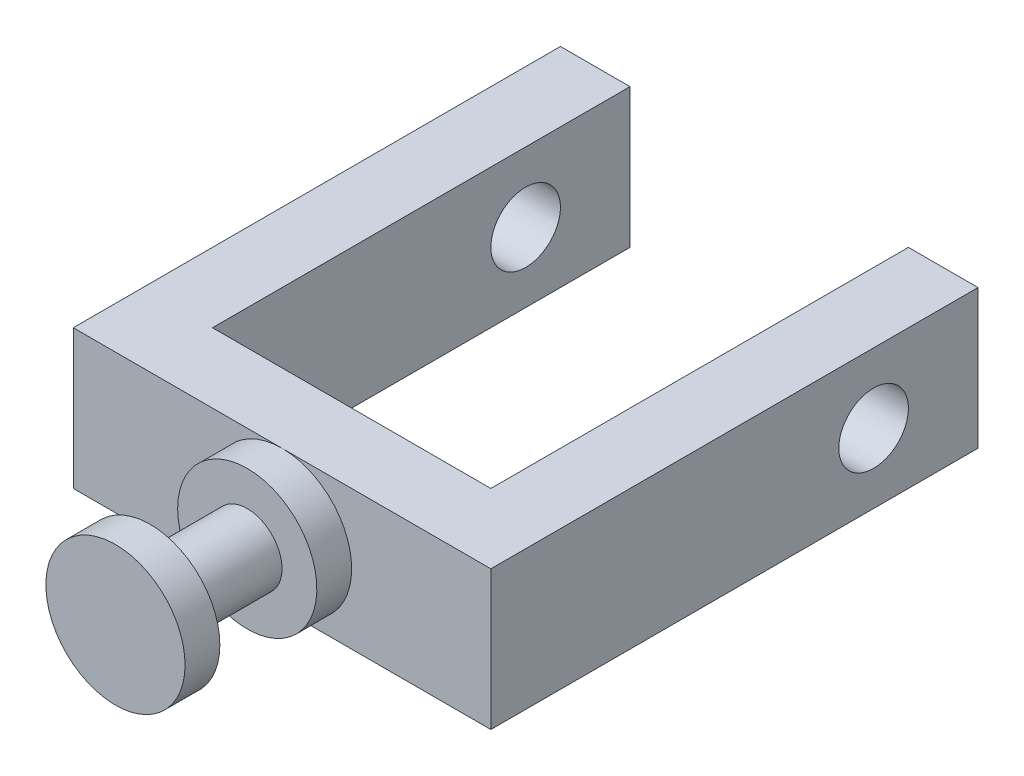
ISO-10303-21;
HEADER;
FILE_DESCRIPTION(('STEP AP214'),'2;1');
FILE_NAME('part.step','',(''),(''),'','','');
FILE_SCHEMA(('AUTOMOTIVE_DESIGN { 1 0 10303 214 1 1 1 1 }'));
ENDSEC;
DATA;
#1=APPLICATION_CONTEXT('core data for automotive mechanical design processes');
#2=APPLICATION_PROTOCOL_DEFINITION('international standard','automotive_design',2000,#1);
#3=PRODUCT_CONTEXT('',#1,'mechanical');
#4=PRODUCT('Part','Part','',(#3));
#5=PRODUCT_RELATED_PRODUCT_CATEGORY('part','',(#4));
#6=PRODUCT_DEFINITION_FORMATION('','',#4);
#7=PRODUCT_DEFINITION_CONTEXT('part definition',#1,'design');
#8=PRODUCT_DEFINITION('design','',#6,#7);
#9=PRODUCT_DEFINITION_SHAPE('','',#8);
#10=(LENGTH_UNIT() NAMED_UNIT(*) SI_UNIT(.MILLI.,.METRE.));
#11=(NAMED_UNIT(*) PLANE_ANGLE_UNIT() SI_UNIT($,.RADIAN.));
#12=(NAMED_UNIT(*) SI_UNIT($,.STERADIAN.) SOLID_ANGLE_UNIT());
#13=UNCERTAINTY_MEASURE_WITH_UNIT(LENGTH_MEASURE(1.E-05),#10,'distance_accuracy_value','');
#14=(GEOMETRIC_REPRESENTATION_CONTEXT(3) GLOBAL_UNCERTAINTY_ASSIGNED_CONTEXT((#13)) GLOBAL_UNIT_ASSIGNED_CONTEXT((#10,
#11,#12)) REPRESENTATION_CONTEXT('',''));
#15=CARTESIAN_POINT('',(0.,0.,0.));
#16=DIRECTION('',(0.,0.,1.));
#17=DIRECTION('',(1.,0.,0.));
#18=AXIS2_PLACEMENT_3D('',#15,#16,#17);
#19=CARTESIAN_POINT('',(0.,0.,-86.2));
#20=DIRECTION('',(0.,0.,-1.));
#21=DIRECTION('',(-1.,0.,0.));
#22=AXIS2_PLACEMENT_3D('',#19,#20,#21);
#23=PLANE('',#22);
#24=DIRECTION('',(-1.,0.,0.));
#25=VECTOR('',#24,1.);
#26=CARTESIAN_POINT('',(76.2,-25.4,-86.2));
#27=LINE('',#26,#25);
#28=CARTESIAN_POINT('',(50.8,-25.4,-86.2));
#29=VERTEX_POINT('',#28);
#30=CARTESIAN_POINT('',(-50.8,-25.4,-86.2));
#31=VERTEX_POINT('',#30);
#32=EDGE_CURVE('E157',#29,#31,#27,.T.);
#33=ORIENTED_EDGE('',*,*,#32,.T.);
#34=DIRECTION('',(0.,-1.,0.));
#35=VECTOR('',#34,1.);
#36=CARTESIAN_POINT('',(-50.8,-25.4,-86.2));
#37=LINE('',#36,#35);
#38=CARTESIAN_POINT('',(-50.8,25.4,-86.2));
#39=VERTEX_POINT('',#38);
#40=EDGE_CURVE('E130',#39,#31,#37,.T.);
#41=ORIENTED_EDGE('',*,*,#40,.F.);
#42=DIRECTION('',(-1.,0.,0.));
#43=VECTOR('',#42,1.);
#44=CARTESIAN_POINT('',(76.2,25.4,-86.2));
#45=LINE('',#44,#43);
#46=CARTESIAN_POINT('',(50.8,25.4,-86.2));
#47=VERTEX_POINT('',#46);
#48=EDGE_CURVE('E159',#47,#39,#45,.T.);
#49=ORIENTED_EDGE('',*,*,#48,.F.);
#50=DIRECTION('',(0.,1.,0.));
#51=VECTOR('',#50,1.);
#52=CARTESIAN_POINT('',(50.8,-25.4,-86.2));
#53=LINE('',#52,#51);
#54=EDGE_CURVE('E53',#29,#47,#53,.T.);
#55=ORIENTED_EDGE('',*,*,#54,.F.);
#56=EDGE_LOOP('',(#33,#41,#49,#55));
#57=FACE_BOUND('',#56,.T.);
#58=ADVANCED_FACE('F36',(#57),#23,.T.);
#59=CARTESIAN_POINT('',(0.,0.,-12.7));
#60=DIRECTION('',(0.,0.,1.));
#61=DIRECTION('',(1.,0.,0.));
#62=AXIS2_PLACEMENT_3D('',#59,#60,#61);
#63=CYLINDRICAL_SURFACE('',#62,25.4);
#64=CARTESIAN_POINT('',(0.,0.,-12.7));
#65=DIRECTION('',(0.,0.,1.));
#66=DIRECTION('',(1.,0.,0.));
#67=AXIS2_PLACEMENT_3D('',#64,#65,#66);
#68=CIRCLE('',#67,25.4);
#69=CARTESIAN_POINT('',(25.4,0.,-12.7));
#70=VERTEX_POINT('',#69);
#71=EDGE_CURVE('E45',#70,#70,#68,.T.);
#72=ORIENTED_EDGE('',*,*,#71,.T.);
#73=EDGE_LOOP('',(#72));
#74=FACE_BOUND('',#73,.T.);
#75=CARTESIAN_POINT('',(0.,0.,0.));
#76=DIRECTION('',(0.,0.,1.));
#77=DIRECTION('',(1.,0.,0.));
#78=AXIS2_PLACEMENT_3D('',#75,#76,#77);
#79=CIRCLE('',#78,25.4);
#80=CARTESIAN_POINT('',(25.4,0.,0.));
#81=VERTEX_POINT('',#80);
#82=EDGE_CURVE('E190',#81,#81,#79,.T.);
#83=ORIENTED_EDGE('',*,*,#82,.F.);
#84=EDGE_LOOP('',(#83));
#85=FACE_BOUND('',#84,.T.);
#86=ADVANCED_FACE('F38',(#74,#85),#63,.T.);
#87=CARTESIAN_POINT('',(0.,0.,-12.7));
#88=DIRECTION('',(0.,0.,1.));
#89=DIRECTION('',(1.,0.,0.));
#90=AXIS2_PLACEMENT_3D('',#87,#88,#89);
#91=PLANE('',#90);
#92=CARTESIAN_POINT('',(0.,0.,-12.7));
#93=DIRECTION('',(0.,0.,-1.));
#94=DIRECTION('',(-1.,0.,0.));
#95=AXIS2_PLACEMENT_3D('',#92,#93,#94);
#96=CIRCLE('',#95,12.7);
#97=CARTESIAN_POINT('',(-12.7,0.,-12.7));
#98=VERTEX_POINT('',#97);
#99=EDGE_CURVE('E11',#98,#98,#96,.T.);
#100=ORIENTED_EDGE('',*,*,#99,.F.);
#101=EDGE_LOOP('',(#100));
#102=FACE_BOUND('',#101,.T.);
#103=ORIENTED_EDGE('',*,*,#71,.F.);
#104=EDGE_LOOP('',(#103));
#105=FACE_BOUND('',#104,.T.);
#106=ADVANCED_FACE('F199',(#102,#105),#91,.F.);
#107=CARTESIAN_POINT('',(0.,0.,0.));
#108=DIRECTION('',(0.,0.,1.));
#109=DIRECTION('',(1.,0.,0.));
#110=AXIS2_PLACEMENT_3D('',#107,#108,#109);
#111=PLANE('',#110);
#112=ORIENTED_EDGE('',*,*,#82,.T.);
#113=EDGE_LOOP('',(#112));
#114=FACE_BOUND('',#113,.T.);
#115=ADVANCED_FACE('F196',(#114),#111,.T.);
#116=CARTESIAN_POINT('',(0.,0.,-48.1));
#117=DIRECTION('',(0.,0.,1.));
#118=DIRECTION('',(1.,0.,0.));
#119=AXIS2_PLACEMENT_3D('',#116,#117,#118);
#120=CYLINDRICAL_SURFACE('',#119,12.7);
#121=CARTESIAN_POINT('',(0.,0.,-48.1));
#122=DIRECTION('',(0.,0.,-1.));
#123=DIRECTION('',(-1.,0.,0.));
#124=AXIS2_PLACEMENT_3D('',#121,#122,#123);
#125=CIRCLE('',#124,12.7);
#126=CARTESIAN_POINT('',(-12.7,0.,-48.1));
#127=VERTEX_POINT('',#126);
#128=EDGE_CURVE('E186',#127,#127,#125,.T.);
#129=ORIENTED_EDGE('',*,*,#128,.F.);
#130=EDGE_LOOP('',(#129));
#131=FACE_BOUND('',#130,.T.);
#132=ORIENTED_EDGE('',*,*,#99,.T.);
#133=EDGE_LOOP('',(#132));
#134=FACE_BOUND('',#133,.T.);
#135=ADVANCED_FACE('F242',(#131,#134),#120,.T.);
#136=CARTESIAN_POINT('',(0.,0.,-60.8));
#137=DIRECTION('',(0.,0.,1.));
#138=DIRECTION('',(1.,0.,0.));
#139=AXIS2_PLACEMENT_3D('',#136,#137,#138);
#140=CYLINDRICAL_SURFACE('',#139,25.4);
#141=CARTESIAN_POINT('',(0.,0.,-60.8));
#142=DIRECTION('',(0.,0.,-1.));
#143=DIRECTION('',(-1.,0.,0.));
#144=AXIS2_PLACEMENT_3D('',#141,#142,#143);
#145=CIRCLE('',#144,25.4);
#146=CARTESIAN_POINT('',(0.,25.4,-60.8));
#147=VERTEX_POINT('',#146);
#148=CARTESIAN_POINT('',(0.,-25.4,-60.8));
#149=VERTEX_POINT('',#148);
#150=EDGE_CURVE('E184',#147,#149,#145,.T.);
#151=ORIENTED_EDGE('',*,*,#150,.F.);
#152=EDGE_CURVE('E60',#149,#147,#145,.T.);
#153=ORIENTED_EDGE('',*,*,#152,.F.);
#154=EDGE_LOOP('',(#151,#153));
#155=FACE_BOUND('',#154,.T.);
#156=CARTESIAN_POINT('',(0.,0.,-48.1));
#157=DIRECTION('',(0.,0.,-1.));
#158=DIRECTION('',(-1.,0.,0.));
#159=AXIS2_PLACEMENT_3D('',#156,#157,#158);
#160=CIRCLE('',#159,25.4);
#161=CARTESIAN_POINT('',(-25.4,0.,-48.1));
#162=VERTEX_POINT('',#161);
#163=EDGE_CURVE('E183',#162,#162,#160,.T.);
#164=ORIENTED_EDGE('',*,*,#163,.T.);
#165=EDGE_LOOP('',(#164));
#166=FACE_BOUND('',#165,.T.);
#167=ADVANCED_FACE('F238',(#155,#166),#140,.T.);
#168=CARTESIAN_POINT('',(0.,0.,-48.1));
#169=DIRECTION('',(0.,0.,-1.));
#170=DIRECTION('',(-1.,0.,0.));
#171=AXIS2_PLACEMENT_3D('',#168,#169,#170);
#172=PLANE('',#171);
#173=ORIENTED_EDGE('',*,*,#128,.T.);
#174=EDGE_LOOP('',(#173));
#175=FACE_BOUND('',#174,.T.);
#176=ORIENTED_EDGE('',*,*,#163,.F.);
#177=EDGE_LOOP('',(#176));
#178=FACE_BOUND('',#177,.T.);
#179=ADVANCED_FACE('F220',(#175,#178),#172,.F.);
#180=CARTESIAN_POINT('',(0.,0.,-60.8));
#181=DIRECTION('',(0.,0.,-1.));
#182=DIRECTION('',(-1.,0.,0.));
#183=AXIS2_PLACEMENT_3D('',#180,#181,#182);
#184=PLANE('',#183);
#185=DIRECTION('',(-1.,0.,0.));
#186=VECTOR('',#185,1.);
#187=CARTESIAN_POINT('',(76.2,25.4,-60.8));
#188=LINE('',#187,#186);
#189=CARTESIAN_POINT('',(76.2,25.4,-60.8));
#190=VERTEX_POINT('',#189);
#191=EDGE_CURVE('E160',#190,#147,#188,.T.);
#192=ORIENTED_EDGE('',*,*,#191,.T.);
#193=ORIENTED_EDGE('',*,*,#150,.T.);
#194=DIRECTION('',(-1.,0.,0.));
#195=VECTOR('',#194,1.);
#196=CARTESIAN_POINT('',(76.2,-25.4,-60.8));
#197=LINE('',#196,#195);
#198=CARTESIAN_POINT('',(76.2,-25.4,-60.8));
#199=VERTEX_POINT('',#198);
#200=EDGE_CURVE('E167',#199,#149,#197,.T.);
#201=ORIENTED_EDGE('',*,*,#200,.F.);
#202=DIRECTION('',(0.,-1.,0.));
#203=VECTOR('',#202,1.);
#204=CARTESIAN_POINT('',(76.2,25.4,-60.8));
#205=LINE('',#204,#203);
#206=EDGE_CURVE('E156',#190,#199,#205,.T.);
#207=ORIENTED_EDGE('',*,*,#206,.F.);
#208=EDGE_LOOP('',(#192,#193,#201,#207));
#209=FACE_BOUND('',#208,.T.);
#210=ADVANCED_FACE('F216',(#209),#184,.F.);
#211=CARTESIAN_POINT('',(-76.2,-25.4,-60.8));
#212=VERTEX_POINT('',#211);
#213=EDGE_CURVE('E166',#149,#212,#197,.T.);
#214=ORIENTED_EDGE('',*,*,#213,.F.);
#215=ORIENTED_EDGE('',*,*,#152,.T.);
#216=CARTESIAN_POINT('',(-76.2,25.4,-60.8));
#217=VERTEX_POINT('',#216);
#218=EDGE_CURVE('E172',#147,#217,#188,.T.);
#219=ORIENTED_EDGE('',*,*,#218,.T.);
#220=DIRECTION('',(0.,-1.,0.));
#221=VECTOR('',#220,1.);
#222=CARTESIAN_POINT('',(-76.2,25.4,-60.8));
#223=LINE('',#222,#221);
#224=EDGE_CURVE('E169',#217,#212,#223,.T.);
#225=ORIENTED_EDGE('',*,*,#224,.T.);
#226=EDGE_LOOP('',(#214,#215,#219,#225));
#227=FACE_BOUND('',#226,.T.);
#228=ADVANCED_FACE('F219',(#227),#184,.F.);
#229=CARTESIAN_POINT('',(76.2,25.4,-86.2));
#230=DIRECTION('',(-1.,0.,0.));
#231=DIRECTION('',(0.,0.,1.));
#232=AXIS2_PLACEMENT_3D('',#229,#230,#231);
#233=PLANE('',#232);
#234=CARTESIAN_POINT('',(76.2,0.,-200.5));
#235=DIRECTION('',(-1.,0.,0.));
#236=DIRECTION('',(0.,0.,1.));
#237=AXIS2_PLACEMENT_3D('',#234,#235,#236);
#238=CIRCLE('',#237,12.7);
#239=CARTESIAN_POINT('',(76.2,0.,-187.8));
#240=VERTEX_POINT('',#239);
#241=EDGE_CURVE('E396',#240,#240,#238,.T.);
#242=ORIENTED_EDGE('',*,*,#241,.T.);
#243=EDGE_LOOP('',(#242));
#244=FACE_BOUND('',#243,.T.);
#245=ORIENTED_EDGE('',*,*,#206,.T.);
#246=DIRECTION('',(0.,0.,1.));
#247=VECTOR('',#246,1.);
#248=CARTESIAN_POINT('',(76.2,-25.4,-86.2));
#249=LINE('',#248,#247);
#250=CARTESIAN_POINT('',(76.2,-25.4,-238.6));
#251=VERTEX_POINT('',#250);
#252=EDGE_CURVE('E180',#251,#199,#249,.T.);
#253=ORIENTED_EDGE('',*,*,#252,.F.);
#254=DIRECTION('',(0.,-1.,0.));
#255=VECTOR('',#254,1.);
#256=CARTESIAN_POINT('',(76.2,-25.4,-238.6));
#257=LINE('',#256,#255);
#258=CARTESIAN_POINT('',(76.2,25.4,-238.6));
#259=VERTEX_POINT('',#258);
#260=EDGE_CURVE('E136',#259,#251,#257,.T.);
#261=ORIENTED_EDGE('',*,*,#260,.F.);
#262=DIRECTION('',(0.,0.,1.));
#263=VECTOR('',#262,1.);
#264=CARTESIAN_POINT('',(76.2,25.4,-86.2));
#265=LINE('',#264,#263);
#266=EDGE_CURVE('E163',#259,#190,#265,.T.);
#267=ORIENTED_EDGE('',*,*,#266,.T.);
#268=EDGE_LOOP('',(#245,#253,#261,#267));
#269=FACE_BOUND('',#268,.T.);
#270=ADVANCED_FACE('F232',(#244,#269),#233,.F.);
#271=CARTESIAN_POINT('',(76.2,-25.4,-86.2));
#272=DIRECTION('',(0.,1.,0.));
#273=DIRECTION('',(0.,0.,1.));
#274=AXIS2_PLACEMENT_3D('',#271,#272,#273);
#275=PLANE('',#274);
#276=ORIENTED_EDGE('',*,*,#200,.T.);
#277=ORIENTED_EDGE('',*,*,#213,.T.);
#278=DIRECTION('',(0.,0.,1.));
#279=VECTOR('',#278,1.);
#280=CARTESIAN_POINT('',(-76.2,-25.4,-86.2));
#281=LINE('',#280,#279);
#282=CARTESIAN_POINT('',(-76.2,-25.4,-238.6));
#283=VERTEX_POINT('',#282);
#284=EDGE_CURVE('E117',#283,#212,#281,.T.);
#285=ORIENTED_EDGE('',*,*,#284,.F.);
#286=DIRECTION('',(-1.,0.,0.));
#287=VECTOR('',#286,1.);
#288=CARTESIAN_POINT('',(-50.8,-25.4,-238.6));
#289=LINE('',#288,#287);
#290=CARTESIAN_POINT('',(-50.8,-25.4,-238.6));
#291=VERTEX_POINT('',#290);
#292=EDGE_CURVE('E109',#291,#283,#289,.T.);
#293=ORIENTED_EDGE('',*,*,#292,.F.);
#294=DIRECTION('',(0.,0.,1.));
#295=VECTOR('',#294,1.);
#296=CARTESIAN_POINT('',(-50.8,-25.4,-238.6));
#297=LINE('',#296,#295);
#298=EDGE_CURVE('E114',#291,#31,#297,.T.);
#299=ORIENTED_EDGE('',*,*,#298,.T.);
#300=ORIENTED_EDGE('',*,*,#32,.F.);
#301=DIRECTION('',(0.,0.,1.));
#302=VECTOR('',#301,1.);
#303=CARTESIAN_POINT('',(50.8,-25.4,-238.6));
#304=LINE('',#303,#302);
#305=CARTESIAN_POINT('',(50.8,-25.4,-238.6));
#306=VERTEX_POINT('',#305);
#307=EDGE_CURVE('E153',#306,#29,#304,.T.);
#308=ORIENTED_EDGE('',*,*,#307,.F.);
#309=DIRECTION('',(-1.,0.,0.));
#310=VECTOR('',#309,1.);
#311=CARTESIAN_POINT('',(50.8,-25.4,-238.6));
#312=LINE('',#311,#310);
#313=EDGE_CURVE('E143',#251,#306,#312,.T.);
#314=ORIENTED_EDGE('',*,*,#313,.F.);
#315=ORIENTED_EDGE('',*,*,#252,.T.);
#316=EDGE_LOOP('',(#276,#277,#285,#293,#299,#300,#308,#314,#315));
#317=FACE_BOUND('',#316,.T.);
#318=ADVANCED_FACE('F112',(#317),#275,.F.);
#319=CARTESIAN_POINT('',(-76.2,25.4,-86.2));
#320=DIRECTION('',(-1.,0.,0.));
#321=DIRECTION('',(0.,0.,1.));
#322=AXIS2_PLACEMENT_3D('',#319,#320,#321);
#323=PLANE('',#322);
#324=CARTESIAN_POINT('',(-76.2,0.,-200.5));
#325=DIRECTION('',(-1.,0.,0.));
#326=DIRECTION('',(0.,0.,1.));
#327=AXIS2_PLACEMENT_3D('',#324,#325,#326);
#328=CIRCLE('',#327,12.7);
#329=CARTESIAN_POINT('',(-76.2,0.,-187.8));
#330=VERTEX_POINT('',#329);
#331=EDGE_CURVE('E400',#330,#330,#328,.T.);
#332=ORIENTED_EDGE('',*,*,#331,.F.);
#333=EDGE_LOOP('',(#332));
#334=FACE_BOUND('',#333,.T.);
#335=ORIENTED_EDGE('',*,*,#224,.F.);
#336=DIRECTION('',(0.,0.,1.));
#337=VECTOR('',#336,1.);
#338=CARTESIAN_POINT('',(-76.2,25.4,-86.2));
#339=LINE('',#338,#337);
#340=CARTESIAN_POINT('',(-76.2,25.4,-238.6));
#341=VERTEX_POINT('',#340);
#342=EDGE_CURVE('E176',#341,#217,#339,.T.);
#343=ORIENTED_EDGE('',*,*,#342,.F.);
#344=DIRECTION('',(0.,1.,0.));
#345=VECTOR('',#344,1.);
#346=CARTESIAN_POINT('',(-76.2,-25.4,-238.6));
#347=LINE('',#346,#345);
#348=EDGE_CURVE('E121',#283,#341,#347,.T.);
#349=ORIENTED_EDGE('',*,*,#348,.F.);
#350=ORIENTED_EDGE('',*,*,#284,.T.);
#351=EDGE_LOOP('',(#335,#343,#349,#350));
#352=FACE_BOUND('',#351,.T.);
#353=ADVANCED_FACE('F225',(#334,#352),#323,.T.);
#354=CARTESIAN_POINT('',(76.2,25.4,-86.2));
#355=DIRECTION('',(0.,1.,0.));
#356=DIRECTION('',(0.,0.,1.));
#357=AXIS2_PLACEMENT_3D('',#354,#355,#356);
#358=PLANE('',#357);
#359=ORIENTED_EDGE('',*,*,#191,.F.);
#360=ORIENTED_EDGE('',*,*,#266,.F.);
#361=DIRECTION('',(1.,0.,0.));
#362=VECTOR('',#361,1.);
#363=CARTESIAN_POINT('',(50.8,25.4,-238.6));
#364=LINE('',#363,#362);
#365=CARTESIAN_POINT('',(50.8,25.4,-238.6));
#366=VERTEX_POINT('',#365);
#367=EDGE_CURVE('E147',#366,#259,#364,.T.);
#368=ORIENTED_EDGE('',*,*,#367,.F.);
#369=DIRECTION('',(0.,0.,1.));
#370=VECTOR('',#369,1.);
#371=CARTESIAN_POINT('',(50.8,25.4,-238.6));
#372=LINE('',#371,#370);
#373=EDGE_CURVE('E149',#366,#47,#372,.T.);
#374=ORIENTED_EDGE('',*,*,#373,.T.);
#375=ORIENTED_EDGE('',*,*,#48,.T.);
#376=DIRECTION('',(0.,0.,1.));
#377=VECTOR('',#376,1.);
#378=CARTESIAN_POINT('',(-50.8,25.4,-238.6));
#379=LINE('',#378,#377);
#380=CARTESIAN_POINT('',(-50.8,25.4,-238.6));
#381=VERTEX_POINT('',#380);
#382=EDGE_CURVE('E134',#381,#39,#379,.T.);
#383=ORIENTED_EDGE('',*,*,#382,.F.);
#384=DIRECTION('',(1.,0.,0.));
#385=VECTOR('',#384,1.);
#386=CARTESIAN_POINT('',(-50.8,25.4,-238.6));
#387=LINE('',#386,#385);
#388=EDGE_CURVE('E127',#341,#381,#387,.T.);
#389=ORIENTED_EDGE('',*,*,#388,.F.);
#390=ORIENTED_EDGE('',*,*,#342,.T.);
#391=ORIENTED_EDGE('',*,*,#218,.F.);
#392=EDGE_LOOP('',(#359,#360,#368,#374,#375,#383,#389,#390,#391));
#393=FACE_BOUND('',#392,.T.);
#394=ADVANCED_FACE('F222',(#393),#358,.T.);
#395=CARTESIAN_POINT('',(50.8,-25.4,-238.6));
#396=DIRECTION('',(1.,0.,0.));
#397=DIRECTION('',(0.,0.,-1.));
#398=AXIS2_PLACEMENT_3D('',#395,#396,#397);
#399=PLANE('',#398);
#400=CARTESIAN_POINT('',(50.8,0.,-200.5));
#401=DIRECTION('',(1.,0.,0.));
#402=DIRECTION('',(0.,0.,-1.));
#403=AXIS2_PLACEMENT_3D('',#400,#401,#402);
#404=CIRCLE('',#403,12.7);
#405=CARTESIAN_POINT('',(50.8,0.,-187.8));
#406=VERTEX_POINT('',#405);
#407=EDGE_CURVE('E399',#406,#406,#404,.T.);
#408=ORIENTED_EDGE('',*,*,#407,.T.);
#409=EDGE_LOOP('',(#408));
#410=FACE_BOUND('',#409,.T.);
#411=ORIENTED_EDGE('',*,*,#54,.T.);
#412=ORIENTED_EDGE('',*,*,#373,.F.);
#413=DIRECTION('',(0.,1.,0.));
#414=VECTOR('',#413,1.);
#415=CARTESIAN_POINT('',(50.8,-25.4,-238.6));
#416=LINE('',#415,#414);
#417=EDGE_CURVE('E145',#306,#366,#416,.T.);
#418=ORIENTED_EDGE('',*,*,#417,.F.);
#419=ORIENTED_EDGE('',*,*,#307,.T.);
#420=EDGE_LOOP('',(#411,#412,#418,#419));
#421=FACE_BOUND('',#420,.T.);
#422=ADVANCED_FACE('F214',(#410,#421),#399,.F.);
#423=CARTESIAN_POINT('',(0.,0.,-238.6));
#424=DIRECTION('',(0.,0.,-1.));
#425=DIRECTION('',(-1.,0.,0.));
#426=AXIS2_PLACEMENT_3D('',#423,#424,#425);
#427=PLANE('',#426);
#428=ORIENTED_EDGE('',*,*,#260,.T.);
#429=ORIENTED_EDGE('',*,*,#313,.T.);
#430=ORIENTED_EDGE('',*,*,#417,.T.);
#431=ORIENTED_EDGE('',*,*,#367,.T.);
#432=EDGE_LOOP('',(#428,#429,#430,#431));
#433=FACE_BOUND('',#432,.T.);
#434=ADVANCED_FACE('F296',(#433),#427,.T.);
#435=CARTESIAN_POINT('',(-50.8,-25.4,-238.6));
#436=DIRECTION('',(-1.,0.,0.));
#437=DIRECTION('',(0.,0.,1.));
#438=AXIS2_PLACEMENT_3D('',#435,#436,#437);
#439=PLANE('',#438);
#440=CARTESIAN_POINT('',(-50.8,0.,-200.5));
#441=DIRECTION('',(-1.,0.,0.));
#442=DIRECTION('',(0.,0.,1.));
#443=AXIS2_PLACEMENT_3D('',#440,#441,#442);
#444=CIRCLE('',#443,12.7);
#445=CARTESIAN_POINT('',(-50.8,0.,-187.8));
#446=VERTEX_POINT('',#445);
#447=EDGE_CURVE('E40',#446,#446,#444,.T.);
#448=ORIENTED_EDGE('',*,*,#447,.T.);
#449=EDGE_LOOP('',(#448));
#450=FACE_BOUND('',#449,.T.);
#451=ORIENTED_EDGE('',*,*,#40,.T.);
#452=ORIENTED_EDGE('',*,*,#298,.F.);
#453=DIRECTION('',(0.,-1.,0.));
#454=VECTOR('',#453,1.);
#455=CARTESIAN_POINT('',(-50.8,-25.4,-238.6));
#456=LINE('',#455,#454);
#457=EDGE_CURVE('E122',#381,#291,#456,.T.);
#458=ORIENTED_EDGE('',*,*,#457,.F.);
#459=ORIENTED_EDGE('',*,*,#382,.T.);
#460=EDGE_LOOP('',(#451,#452,#458,#459));
#461=FACE_BOUND('',#460,.T.);
#462=ADVANCED_FACE('F132',(#450,#461),#439,.F.);
#463=CARTESIAN_POINT('',(0.,0.,-238.6));
#464=DIRECTION('',(0.,0.,1.));
#465=DIRECTION('',(1.,0.,0.));
#466=AXIS2_PLACEMENT_3D('',#463,#464,#465);
#467=PLANE('',#466);
#468=ORIENTED_EDGE('',*,*,#457,.T.);
#469=ORIENTED_EDGE('',*,*,#292,.T.);
#470=ORIENTED_EDGE('',*,*,#348,.T.);
#471=ORIENTED_EDGE('',*,*,#388,.T.);
#472=EDGE_LOOP('',(#468,#469,#470,#471));
#473=FACE_BOUND('',#472,.T.);
#474=ADVANCED_FACE('F125',(#473),#467,.F.);
#475=CARTESIAN_POINT('',(76.2,0.,-200.5));
#476=DIRECTION('',(-1.,0.,0.));
#477=DIRECTION('',(0.,0.,1.));
#478=AXIS2_PLACEMENT_3D('',#475,#476,#477);
#479=CYLINDRICAL_SURFACE('',#478,12.7);
#480=CARTESIAN_POINT('',(-76.2,0.,-187.8));
#481=CARTESIAN_POINT('',(-75.9354166666667,0.,-187.8));
#482=CARTESIAN_POINT('',(-75.6708333333333,0.,-187.8));
#483=CARTESIAN_POINT('',(-75.1416666666667,0.,-187.8));
#484=CARTESIAN_POINT('',(-74.8770833333333,0.,-187.8));
#485=CARTESIAN_POINT('',(-74.3479166666667,0.,-187.8));
#486=CARTESIAN_POINT('',(-74.0833333333333,0.,-187.8));
#487=CARTESIAN_POINT('',(-73.5541666666667,0.,-187.8));
#488=CARTESIAN_POINT('',(-73.2895833333333,0.,-187.8));
#489=CARTESIAN_POINT('',(-72.7604166666667,0.,-187.8));
#490=CARTESIAN_POINT('',(-72.4958333333333,0.,-187.8));
#491=CARTESIAN_POINT('',(-71.9666666666667,0.,-187.8));
#492=CARTESIAN_POINT('',(-71.7020833333333,0.,-187.8));
#493=CARTESIAN_POINT('',(-71.1729166666667,0.,-187.8));
#494=CARTESIAN_POINT('',(-70.9083333333333,0.,-187.8));
#495=CARTESIAN_POINT('',(-70.3791666666667,0.,-187.8));
#496=CARTESIAN_POINT('',(-70.1145833333333,0.,-187.8));
#497=CARTESIAN_POINT('',(-69.5854166666666,0.,-187.8));
#498=CARTESIAN_POINT('',(-69.3208333333333,0.,-187.8));
#499=CARTESIAN_POINT('',(-68.7916666666667,0.,-187.8));
#500=CARTESIAN_POINT('',(-68.5270833333333,0.,-187.8));
#501=CARTESIAN_POINT('',(-67.9979166666667,0.,-187.8));
#502=CARTESIAN_POINT('',(-67.7333333333333,0.,-187.8));
#503=CARTESIAN_POINT('',(-67.2041666666667,0.,-187.8));
#504=CARTESIAN_POINT('',(-66.9395833333333,0.,-187.8));
#505=CARTESIAN_POINT('',(-66.4104166666667,0.,-187.8));
#506=CARTESIAN_POINT('',(-66.1458333333333,0.,-187.8));
#507=CARTESIAN_POINT('',(-65.6166666666667,0.,-187.8));
#508=CARTESIAN_POINT('',(-65.3520833333333,0.,-187.8));
#509=CARTESIAN_POINT('',(-64.8229166666666,0.,-187.8));
#510=CARTESIAN_POINT('',(-64.5583333333333,0.,-187.8));
#511=CARTESIAN_POINT('',(-64.0291666666667,0.,-187.8));
#512=CARTESIAN_POINT('',(-63.7645833333333,0.,-187.8));
#513=CARTESIAN_POINT('',(-63.2354166666667,0.,-187.8));
#514=CARTESIAN_POINT('',(-62.9708333333333,0.,-187.8));
#515=CARTESIAN_POINT('',(-62.4416666666667,0.,-187.8));
#516=CARTESIAN_POINT('',(-62.1770833333333,0.,-187.8));
#517=CARTESIAN_POINT('',(-61.6479166666667,0.,-187.8));
#518=CARTESIAN_POINT('',(-61.3833333333333,0.,-187.8));
#519=CARTESIAN_POINT('',(-60.8541666666667,0.,-187.8));
#520=CARTESIAN_POINT('',(-60.5895833333333,0.,-187.8));
#521=CARTESIAN_POINT('',(-60.0604166666667,0.,-187.8));
#522=CARTESIAN_POINT('',(-59.7958333333333,0.,-187.8));
#523=CARTESIAN_POINT('',(-59.2666666666667,0.,-187.8));
#524=CARTESIAN_POINT('',(-59.0020833333333,0.,-187.8));
#525=CARTESIAN_POINT('',(-58.4729166666666,0.,-187.8));
#526=CARTESIAN_POINT('',(-58.2083333333333,0.,-187.8));
#527=CARTESIAN_POINT('',(-57.6791666666667,0.,-187.8));
#528=CARTESIAN_POINT('',(-57.4145833333333,0.,-187.8));
#529=CARTESIAN_POINT('',(-56.8854166666667,0.,-187.8));
#530=CARTESIAN_POINT('',(-56.6208333333333,0.,-187.8));
#531=CARTESIAN_POINT('',(-56.0916666666666,0.,-187.8));
#532=CARTESIAN_POINT('',(-55.8270833333333,0.,-187.8));
#533=CARTESIAN_POINT('',(-55.2979166666667,0.,-187.8));
#534=CARTESIAN_POINT('',(-55.0333333333333,0.,-187.8));
#535=CARTESIAN_POINT('',(-54.5041666666666,0.,-187.8));
#536=CARTESIAN_POINT('',(-54.2395833333333,0.,-187.8));
#537=CARTESIAN_POINT('',(-53.7104166666666,0.,-187.8));
#538=CARTESIAN_POINT('',(-53.4458333333333,0.,-187.8));
#539=CARTESIAN_POINT('',(-52.9166666666666,0.,-187.8));
#540=CARTESIAN_POINT('',(-52.6520833333333,0.,-187.8));
#541=CARTESIAN_POINT('',(-52.1229166666666,0.,-187.8));
#542=CARTESIAN_POINT('',(-51.8583333333333,0.,-187.8));
#543=CARTESIAN_POINT('',(-51.3291666666666,0.,-187.8));
#544=CARTESIAN_POINT('',(-51.0645833333333,0.,-187.8));
#545=CARTESIAN_POINT('',(-50.8,0.,-187.8));
#546=B_SPLINE_CURVE_WITH_KNOTS('',3,(#480,#481,#482,#483,#484,#485,#486,#487,#488,#489,#490,
#491,#492,#493,#494,#495,#496,#497,#498,#499,#500,#501,#502,#503,#504,#505,#506,#507,#508,#509,
#510,#511,#512,#513,#514,#515,#516,#517,#518,#519,#520,#521,#522,#523,#524,#525,#526,#527,#528,
#529,#530,#531,#532,#533,#534,#535,#536,#537,#538,#539,#540,#541,#542,#543,#544,#545),
.UNSPECIFIED.,.F.,.F.,(4,2,2,2,2,2,2,2,2,2,2,2,2,2,2,2,2,2,2,2,2,2,2,2,2,2,2,2,2,2,2,2,4),(0.,
0.79375000000001,1.58749999999999,2.38125,3.17500000000001,3.96874999999999,4.7625,
5.55625000000001,6.35000000000002,7.14375,7.93750000000001,8.73125000000002,9.52500000000001,
10.31875,11.1125,11.90625,12.7,13.49375,14.2875,15.08125,15.875,16.66875,17.4625,18.25625,19.05,
19.84375,20.6375,21.43125,22.225,23.01875,23.8125,24.60625,25.4),.UNSPECIFIED.);
#547=EDGE_CURVE('BSEAM315',#330,#446,#546,.T.);
#548=ORIENTED_EDGE('',*,*,#331,.T.);
#549=ORIENTED_EDGE('',*,*,#447,.F.);
#550=ORIENTED_EDGE('',*,*,#547,.T.);
#551=ORIENTED_EDGE('',*,*,#547,.F.);
#552=EDGE_LOOP('',(#548,#550,#549,#551));
#553=FACE_BOUND('',#552,.T.);
#554=ADVANCED_FACE('F315',(#553),#479,.F.);
#555=CARTESIAN_POINT('',(76.2,0.,-187.8));
#556=CARTESIAN_POINT('',(75.9354166666667,0.,-187.8));
#557=CARTESIAN_POINT('',(75.6708333333333,0.,-187.8));
#558=CARTESIAN_POINT('',(75.1416666666667,0.,-187.8));
#559=CARTESIAN_POINT('',(74.8770833333333,0.,-187.8));
#560=CARTESIAN_POINT('',(74.3479166666667,0.,-187.8));
#561=CARTESIAN_POINT('',(74.0833333333333,0.,-187.8));
#562=CARTESIAN_POINT('',(73.5541666666667,0.,-187.8));
#563=CARTESIAN_POINT('',(73.2895833333333,0.,-187.8));
#564=CARTESIAN_POINT('',(72.7604166666667,0.,-187.8));
#565=CARTESIAN_POINT('',(72.4958333333333,0.,-187.8));
#566=CARTESIAN_POINT('',(71.9666666666667,0.,-187.8));
#567=CARTESIAN_POINT('',(71.7020833333333,0.,-187.8));
#568=CARTESIAN_POINT('',(71.1729166666667,0.,-187.8));
#569=CARTESIAN_POINT('',(70.9083333333333,0.,-187.8));
#570=CARTESIAN_POINT('',(70.3791666666667,0.,-187.8));
#571=CARTESIAN_POINT('',(70.1145833333333,0.,-187.8));
#572=CARTESIAN_POINT('',(69.5854166666667,0.,-187.8));
#573=CARTESIAN_POINT('',(69.3208333333333,0.,-187.8));
#574=CARTESIAN_POINT('',(68.7916666666667,0.,-187.8));
#575=CARTESIAN_POINT('',(68.5270833333333,0.,-187.8));
#576=CARTESIAN_POINT('',(67.9979166666667,0.,-187.8));
#577=CARTESIAN_POINT('',(67.7333333333333,0.,-187.8));
#578=CARTESIAN_POINT('',(67.2041666666667,0.,-187.8));
#579=CARTESIAN_POINT('',(66.9395833333333,0.,-187.8));
#580=CARTESIAN_POINT('',(66.4104166666667,0.,-187.8));
#581=CARTESIAN_POINT('',(66.1458333333333,0.,-187.8));
#582=CARTESIAN_POINT('',(65.6166666666667,0.,-187.8));
#583=CARTESIAN_POINT('',(65.3520833333333,0.,-187.8));
#584=CARTESIAN_POINT('',(64.8229166666667,0.,-187.8));
#585=CARTESIAN_POINT('',(64.5583333333333,0.,-187.8));
#586=CARTESIAN_POINT('',(64.0291666666667,0.,-187.8));
#587=CARTESIAN_POINT('',(63.7645833333333,0.,-187.8));
#588=CARTESIAN_POINT('',(63.2354166666667,0.,-187.8));
#589=CARTESIAN_POINT('',(62.9708333333333,0.,-187.8));
#590=CARTESIAN_POINT('',(62.4416666666667,0.,-187.8));
#591=CARTESIAN_POINT('',(62.1770833333333,0.,-187.8));
#592=CARTESIAN_POINT('',(61.6479166666667,0.,-187.8));
#593=CARTESIAN_POINT('',(61.3833333333333,0.,-187.8));
#594=CARTESIAN_POINT('',(60.8541666666667,0.,-187.8));
#595=CARTESIAN_POINT('',(60.5895833333333,0.,-187.8));
#596=CARTESIAN_POINT('',(60.0604166666667,0.,-187.8));
#597=CARTESIAN_POINT('',(59.7958333333333,0.,-187.8));
#598=CARTESIAN_POINT('',(59.2666666666667,0.,-187.8));
#599=CARTESIAN_POINT('',(59.0020833333333,0.,-187.8));
#600=CARTESIAN_POINT('',(58.4729166666667,0.,-187.8));
#601=CARTESIAN_POINT('',(58.2083333333333,0.,-187.8));
#602=CARTESIAN_POINT('',(57.6791666666667,0.,-187.8));
#603=CARTESIAN_POINT('',(57.4145833333333,0.,-187.8));
#604=CARTESIAN_POINT('',(56.8854166666667,0.,-187.8));
#605=CARTESIAN_POINT('',(56.6208333333333,0.,-187.8));
#606=CARTESIAN_POINT('',(56.0916666666667,0.,-187.8));
#607=CARTESIAN_POINT('',(55.8270833333333,0.,-187.8));
#608=CARTESIAN_POINT('',(55.2979166666667,0.,-187.8));
#609=CARTESIAN_POINT('',(55.0333333333333,0.,-187.8));
#610=CARTESIAN_POINT('',(54.5041666666667,0.,-187.8));
#611=CARTESIAN_POINT('',(54.2395833333333,0.,-187.8));
#612=CARTESIAN_POINT('',(53.7104166666667,0.,-187.8));
#613=CARTESIAN_POINT('',(53.4458333333333,0.,-187.8));
#614=CARTESIAN_POINT('',(52.9166666666667,0.,-187.8));
#615=CARTESIAN_POINT('',(52.6520833333333,0.,-187.8));
#616=CARTESIAN_POINT('',(52.1229166666667,0.,-187.8));
#617=CARTESIAN_POINT('',(51.8583333333333,0.,-187.8));
#618=CARTESIAN_POINT('',(51.3291666666667,0.,-187.8));
#619=CARTESIAN_POINT('',(51.0645833333333,0.,-187.8));
#620=CARTESIAN_POINT('',(50.8,0.,-187.8));
#621=B_SPLINE_CURVE_WITH_KNOTS('',3,(#555,#556,#557,#558,#559,#560,#561,#562,#563,#564,#565,
#566,#567,#568,#569,#570,#571,#572,#573,#574,#575,#576,#577,#578,#579,#580,#581,#582,#583,#584,
#585,#586,#587,#588,#589,#590,#591,#592,#593,#594,#595,#596,#597,#598,#599,#600,#601,#602,#603,
#604,#605,#606,#607,#608,#609,#610,#611,#612,#613,#614,#615,#616,#617,#618,#619,#620),
.UNSPECIFIED.,.F.,.F.,(4,2,2,2,2,2,2,2,2,2,2,2,2,2,2,2,2,2,2,2,2,2,2,2,2,2,2,2,2,2,2,2,4),(0.,
0.793749999999996,1.58749999999999,2.38124999999999,3.175,3.96874999999999,4.76249999999999,
5.55625,6.34999999999999,7.14374999999999,7.9375,8.73125,9.52499999999999,10.31875,11.1125,
11.90625,12.7,13.49375,14.2875,15.08125,15.875,16.66875,17.4625,18.25625,19.05,19.84375,20.6375,
21.43125,22.225,23.01875,23.8125,24.60625,25.4),.UNSPECIFIED.);
#622=EDGE_CURVE('BSEAM321',#240,#406,#621,.T.);
#623=ORIENTED_EDGE('',*,*,#241,.F.);
#624=ORIENTED_EDGE('',*,*,#407,.F.);
#625=ORIENTED_EDGE('',*,*,#622,.T.);
#626=ORIENTED_EDGE('',*,*,#622,.F.);
#627=EDGE_LOOP('',(#623,#625,#624,#626));
#628=FACE_BOUND('',#627,.T.);
#629=ADVANCED_FACE('F321',(#628),#479,.F.);
#630=CLOSED_SHELL('',(#58,#86,#106,#115,#135,#167,#179,#210,#228,#270,#318,#353,#394,#422,#434,
#462,#474,#554,#629));
#631=MANIFOLD_SOLID_BREP('B2',#630);
#632=ADVANCED_BREP_SHAPE_REPRESENTATION('',(#18,#631),#14);
#633=SHAPE_DEFINITION_REPRESENTATION(#9,#632);
ENDSEC;
END-ISO-10303-21;
